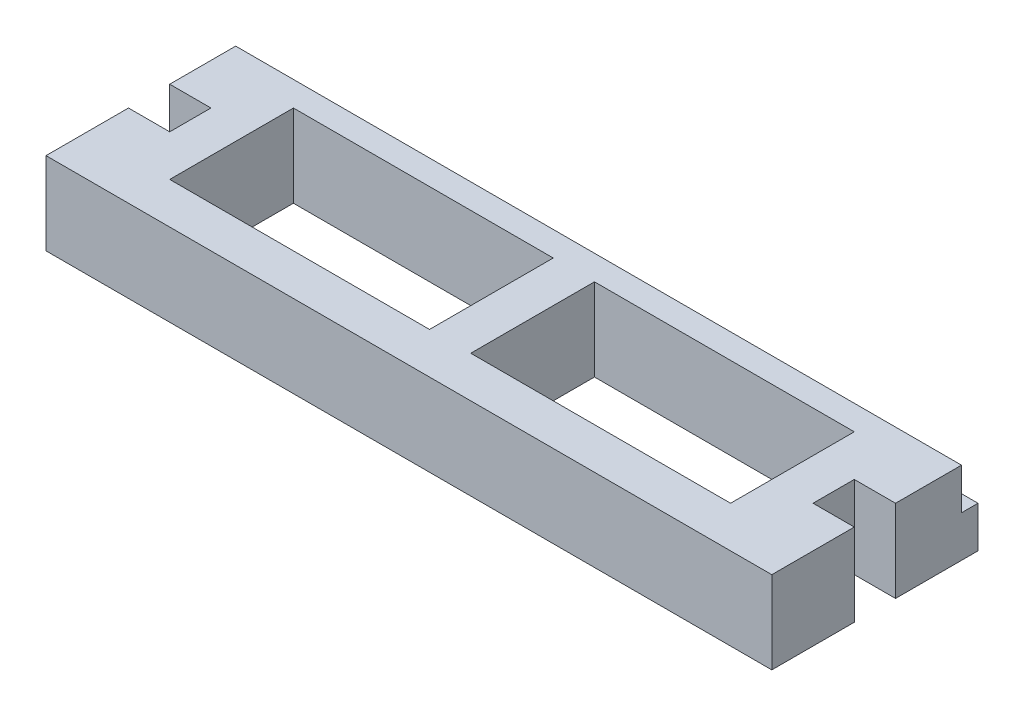
ISO-10303-21;
HEADER;
FILE_DESCRIPTION(('STEP AP214'),'2;1');
FILE_NAME('part.step','',(''),(''),'','','');
FILE_SCHEMA(('AUTOMOTIVE_DESIGN { 1 0 10303 214 1 1 1 1 }'));
ENDSEC;
DATA;
#1=APPLICATION_CONTEXT('core data for automotive mechanical design processes');
#2=APPLICATION_PROTOCOL_DEFINITION('international standard','automotive_design',2000,#1);
#3=PRODUCT_CONTEXT('',#1,'mechanical');
#4=PRODUCT('Part','Part','',(#3));
#5=PRODUCT_RELATED_PRODUCT_CATEGORY('part','',(#4));
#6=PRODUCT_DEFINITION_FORMATION('','',#4);
#7=PRODUCT_DEFINITION_CONTEXT('part definition',#1,'design');
#8=PRODUCT_DEFINITION('design','',#6,#7);
#9=PRODUCT_DEFINITION_SHAPE('','',#8);
#10=(LENGTH_UNIT() NAMED_UNIT(*) SI_UNIT(.MILLI.,.METRE.));
#11=(NAMED_UNIT(*) PLANE_ANGLE_UNIT() SI_UNIT($,.RADIAN.));
#12=(NAMED_UNIT(*) SI_UNIT($,.STERADIAN.) SOLID_ANGLE_UNIT());
#13=UNCERTAINTY_MEASURE_WITH_UNIT(LENGTH_MEASURE(1.E-05),#10,'distance_accuracy_value','');
#14=(GEOMETRIC_REPRESENTATION_CONTEXT(3) GLOBAL_UNCERTAINTY_ASSIGNED_CONTEXT((#13)) GLOBAL_UNIT_ASSIGNED_CONTEXT((#10,
#11,#12)) REPRESENTATION_CONTEXT('',''));
#15=CARTESIAN_POINT('',(0.,0.,0.));
#16=DIRECTION('',(0.,0.,1.));
#17=DIRECTION('',(1.,0.,0.));
#18=AXIS2_PLACEMENT_3D('',#15,#16,#17);
#19=CARTESIAN_POINT('',(0.,10.,0.));
#20=DIRECTION('',(0.,1.,0.));
#21=DIRECTION('',(0.,0.,1.));
#22=AXIS2_PLACEMENT_3D('',#19,#20,#21);
#23=PLANE('',#22);
#24=DIRECTION('',(-1.,0.,0.));
#25=VECTOR('',#24,1.);
#26=CARTESIAN_POINT('',(0.,10.,7.50000000000003));
#27=LINE('',#26,#25);
#28=CARTESIAN_POINT('',(34.,10.,7.50000000000003));
#29=VERTEX_POINT('',#28);
#30=CARTESIAN_POINT('',(2.5,10.,7.50000000000003));
#31=VERTEX_POINT('',#30);
#32=EDGE_CURVE('E342',#29,#31,#27,.T.);
#33=ORIENTED_EDGE('',*,*,#32,.T.);
#34=DIRECTION('',(0.,0.,-1.));
#35=VECTOR('',#34,1.);
#36=CARTESIAN_POINT('',(2.5,10.,0.));
#37=LINE('',#36,#35);
#38=CARTESIAN_POINT('',(2.5,10.,-7.5));
#39=VERTEX_POINT('',#38);
#40=EDGE_CURVE('E293',#31,#39,#37,.T.);
#41=ORIENTED_EDGE('',*,*,#40,.T.);
#42=DIRECTION('',(-1.,0.,0.));
#43=VECTOR('',#42,1.);
#44=CARTESIAN_POINT('',(0.,10.,-7.5));
#45=LINE('',#44,#43);
#46=CARTESIAN_POINT('',(34.,10.,-7.50000000000001));
#47=VERTEX_POINT('',#46);
#48=EDGE_CURVE('E331',#47,#39,#45,.T.);
#49=ORIENTED_EDGE('',*,*,#48,.F.);
#50=DIRECTION('',(0.,0.,1.));
#51=VECTOR('',#50,1.);
#52=CARTESIAN_POINT('',(34.,10.,0.));
#53=LINE('',#52,#51);
#54=EDGE_CURVE('E345',#47,#29,#53,.T.);
#55=ORIENTED_EDGE('',*,*,#54,.T.);
#56=EDGE_LOOP('',(#33,#41,#49,#55));
#57=FACE_BOUND('',#56,.T.);
#58=DIRECTION('',(-1.,0.,0.));
#59=VECTOR('',#58,1.);
#60=CARTESIAN_POINT('',(0.,10.,-7.5));
#61=LINE('',#60,#59);
#62=CARTESIAN_POINT('',(-2.5,10.,-7.5));
#63=VERTEX_POINT('',#62);
#64=CARTESIAN_POINT('',(-34.,10.,-7.5));
#65=VERTEX_POINT('',#64);
#66=EDGE_CURVE('E309',#63,#65,#61,.T.);
#67=ORIENTED_EDGE('',*,*,#66,.F.);
#68=DIRECTION('',(0.,0.,1.));
#69=VECTOR('',#68,1.);
#70=CARTESIAN_POINT('',(-2.5,10.,0.));
#71=LINE('',#70,#69);
#72=CARTESIAN_POINT('',(-2.5,10.,7.50000000000004));
#73=VERTEX_POINT('',#72);
#74=EDGE_CURVE('E306',#63,#73,#71,.T.);
#75=ORIENTED_EDGE('',*,*,#74,.T.);
#76=DIRECTION('',(-1.,0.,0.));
#77=VECTOR('',#76,1.);
#78=CARTESIAN_POINT('',(0.,10.,7.50000000000004));
#79=LINE('',#78,#77);
#80=CARTESIAN_POINT('',(-34.,10.,7.50000000000002));
#81=VERTEX_POINT('',#80);
#82=EDGE_CURVE('E297',#73,#81,#79,.T.);
#83=ORIENTED_EDGE('',*,*,#82,.T.);
#84=DIRECTION('',(0.,0.,-1.));
#85=VECTOR('',#84,1.);
#86=CARTESIAN_POINT('',(-34.,10.,0.));
#87=LINE('',#86,#85);
#88=EDGE_CURVE('E313',#81,#65,#87,.T.);
#89=ORIENTED_EDGE('',*,*,#88,.T.);
#90=EDGE_LOOP('',(#67,#75,#83,#89));
#91=FACE_BOUND('',#90,.T.);
#92=DIRECTION('',(0.,0.,1.));
#93=VECTOR('',#92,1.);
#94=CARTESIAN_POINT('',(44.,10.,-12.5));
#95=LINE('',#94,#93);
#96=CARTESIAN_POINT('',(44.,10.,-10.5));
#97=VERTEX_POINT('',#96);
#98=CARTESIAN_POINT('',(44.,10.,-2.5));
#99=VERTEX_POINT('',#98);
#100=EDGE_CURVE('E273',#97,#99,#95,.T.);
#101=ORIENTED_EDGE('',*,*,#100,.F.);
#102=DIRECTION('',(1.,0.,0.));
#103=VECTOR('',#102,1.);
#104=CARTESIAN_POINT('',(44.,10.,-10.5));
#105=LINE('',#104,#103);
#106=CARTESIAN_POINT('',(-44.,10.,-10.5));
#107=VERTEX_POINT('',#106);
#108=EDGE_CURVE('E60',#107,#97,#105,.T.);
#109=ORIENTED_EDGE('',*,*,#108,.F.);
#110=DIRECTION('',(0.,0.,-1.));
#111=VECTOR('',#110,1.);
#112=CARTESIAN_POINT('',(-44.,10.,-12.5));
#113=LINE('',#112,#111);
#114=CARTESIAN_POINT('',(-44.,10.,-2.5));
#115=VERTEX_POINT('',#114);
#116=EDGE_CURVE('E289',#115,#107,#113,.T.);
#117=ORIENTED_EDGE('',*,*,#116,.F.);
#118=DIRECTION('',(-1.,0.,0.));
#119=VECTOR('',#118,1.);
#120=CARTESIAN_POINT('',(-39.,10.,-2.5));
#121=LINE('',#120,#119);
#122=CARTESIAN_POINT('',(-39.,10.,-2.5));
#123=VERTEX_POINT('',#122);
#124=EDGE_CURVE('E236',#123,#115,#121,.T.);
#125=ORIENTED_EDGE('',*,*,#124,.F.);
#126=DIRECTION('',(0.,0.,-1.));
#127=VECTOR('',#126,1.);
#128=CARTESIAN_POINT('',(-39.,10.,-2.5));
#129=LINE('',#128,#127);
#130=CARTESIAN_POINT('',(-39.,10.,2.5));
#131=VERTEX_POINT('',#130);
#132=EDGE_CURVE('E230',#131,#123,#129,.T.);
#133=ORIENTED_EDGE('',*,*,#132,.F.);
#134=DIRECTION('',(-1.,0.,0.));
#135=VECTOR('',#134,1.);
#136=CARTESIAN_POINT('',(-39.,10.,2.5));
#137=LINE('',#136,#135);
#138=CARTESIAN_POINT('',(-44.,10.,2.5));
#139=VERTEX_POINT('',#138);
#140=EDGE_CURVE('E239',#131,#139,#137,.T.);
#141=ORIENTED_EDGE('',*,*,#140,.T.);
#142=CARTESIAN_POINT('',(-44.,10.,12.5));
#143=VERTEX_POINT('',#142);
#144=EDGE_CURVE('E290',#143,#139,#113,.T.);
#145=ORIENTED_EDGE('',*,*,#144,.F.);
#146=DIRECTION('',(1.,0.,0.));
#147=VECTOR('',#146,1.);
#148=CARTESIAN_POINT('',(-49.,10.,12.5));
#149=LINE('',#148,#147);
#150=CARTESIAN_POINT('',(44.,10.,12.5));
#151=VERTEX_POINT('',#150);
#152=EDGE_CURVE('E11',#143,#151,#149,.T.);
#153=ORIENTED_EDGE('',*,*,#152,.T.);
#154=CARTESIAN_POINT('',(44.,10.,2.5));
#155=VERTEX_POINT('',#154);
#156=EDGE_CURVE('E272',#155,#151,#95,.T.);
#157=ORIENTED_EDGE('',*,*,#156,.F.);
#158=DIRECTION('',(1.,0.,0.));
#159=VECTOR('',#158,1.);
#160=CARTESIAN_POINT('',(39.,10.,2.5));
#161=LINE('',#160,#159);
#162=CARTESIAN_POINT('',(39.,10.,2.5));
#163=VERTEX_POINT('',#162);
#164=EDGE_CURVE('E262',#163,#155,#161,.T.);
#165=ORIENTED_EDGE('',*,*,#164,.F.);
#166=DIRECTION('',(0.,0.,1.));
#167=VECTOR('',#166,1.);
#168=CARTESIAN_POINT('',(39.,10.,2.5));
#169=LINE('',#168,#167);
#170=CARTESIAN_POINT('',(39.,10.,-2.5));
#171=VERTEX_POINT('',#170);
#172=EDGE_CURVE('E255',#171,#163,#169,.T.);
#173=ORIENTED_EDGE('',*,*,#172,.F.);
#174=DIRECTION('',(1.,0.,0.));
#175=VECTOR('',#174,1.);
#176=CARTESIAN_POINT('',(39.,10.,-2.5));
#177=LINE('',#176,#175);
#178=EDGE_CURVE('E264',#171,#99,#177,.T.);
#179=ORIENTED_EDGE('',*,*,#178,.T.);
#180=EDGE_LOOP('',(#101,#109,#117,#125,#133,#141,#145,#153,#157,#165,#173,#179));
#181=FACE_BOUND('',#180,.T.);
#182=ADVANCED_FACE('F44',(#57,#91,#181),#23,.T.);
#183=CARTESIAN_POINT('',(-44.,0.,0.));
#184=DIRECTION('',(1.,0.,0.));
#185=DIRECTION('',(0.,0.,-1.));
#186=AXIS2_PLACEMENT_3D('',#183,#184,#185);
#187=PLANE('',#186);
#188=DIRECTION('',(0.,1.,0.));
#189=VECTOR('',#188,1.);
#190=CARTESIAN_POINT('',(-44.,10.,-10.5));
#191=LINE('',#190,#189);
#192=CARTESIAN_POINT('',(-44.,5.,-10.5));
#193=VERTEX_POINT('',#192);
#194=EDGE_CURVE('E202',#193,#107,#191,.T.);
#195=ORIENTED_EDGE('',*,*,#194,.F.);
#196=DIRECTION('',(0.,0.,-1.));
#197=VECTOR('',#196,1.);
#198=CARTESIAN_POINT('',(-44.,5.,-10.5));
#199=LINE('',#198,#197);
#200=CARTESIAN_POINT('',(-44.,5.,-12.5));
#201=VERTEX_POINT('',#200);
#202=EDGE_CURVE('E200',#193,#201,#199,.T.);
#203=ORIENTED_EDGE('',*,*,#202,.T.);
#204=DIRECTION('',(0.,-1.,0.));
#205=VECTOR('',#204,1.);
#206=CARTESIAN_POINT('',(-44.,0.,-12.5));
#207=LINE('',#206,#205);
#208=CARTESIAN_POINT('',(-44.,0.,-12.5));
#209=VERTEX_POINT('',#208);
#210=EDGE_CURVE('E281',#201,#209,#207,.T.);
#211=ORIENTED_EDGE('',*,*,#210,.T.);
#212=DIRECTION('',(0.,0.,1.));
#213=VECTOR('',#212,1.);
#214=CARTESIAN_POINT('',(-44.,0.,-12.5));
#215=LINE('',#214,#213);
#216=CARTESIAN_POINT('',(-44.,0.,-2.5));
#217=VERTEX_POINT('',#216);
#218=EDGE_CURVE('E284',#209,#217,#215,.T.);
#219=ORIENTED_EDGE('',*,*,#218,.T.);
#220=DIRECTION('',(0.,-1.,0.));
#221=VECTOR('',#220,1.);
#222=CARTESIAN_POINT('',(-44.,0.,-2.5));
#223=LINE('',#222,#221);
#224=EDGE_CURVE('E215',#115,#217,#223,.T.);
#225=ORIENTED_EDGE('',*,*,#224,.F.);
#226=ORIENTED_EDGE('',*,*,#116,.T.);
#227=EDGE_LOOP('',(#195,#203,#211,#219,#225,#226));
#228=FACE_BOUND('',#227,.T.);
#229=ADVANCED_FACE('F396',(#228),#187,.F.);
#230=CARTESIAN_POINT('',(44.,0.,0.));
#231=DIRECTION('',(-1.,0.,0.));
#232=DIRECTION('',(0.,0.,1.));
#233=AXIS2_PLACEMENT_3D('',#230,#231,#232);
#234=PLANE('',#233);
#235=DIRECTION('',(0.,0.,-1.));
#236=VECTOR('',#235,1.);
#237=CARTESIAN_POINT('',(44.,0.,-12.5));
#238=LINE('',#237,#236);
#239=CARTESIAN_POINT('',(44.,0.,12.5));
#240=VERTEX_POINT('',#239);
#241=CARTESIAN_POINT('',(44.,0.,2.5));
#242=VERTEX_POINT('',#241);
#243=EDGE_CURVE('E278',#240,#242,#238,.T.);
#244=ORIENTED_EDGE('',*,*,#243,.T.);
#245=DIRECTION('',(0.,-1.,0.));
#246=VECTOR('',#245,1.);
#247=CARTESIAN_POINT('',(44.,10.,2.5));
#248=LINE('',#247,#246);
#249=EDGE_CURVE('E238',#155,#242,#248,.T.);
#250=ORIENTED_EDGE('',*,*,#249,.F.);
#251=ORIENTED_EDGE('',*,*,#156,.T.);
#252=DIRECTION('',(0.,-1.,0.));
#253=VECTOR('',#252,1.);
#254=CARTESIAN_POINT('',(44.,10.,12.5));
#255=LINE('',#254,#253);
#256=EDGE_CURVE('E275',#151,#240,#255,.T.);
#257=ORIENTED_EDGE('',*,*,#256,.T.);
#258=EDGE_LOOP('',(#244,#250,#251,#257));
#259=FACE_BOUND('',#258,.T.);
#260=ADVANCED_FACE('F377',(#259),#234,.F.);
#261=CARTESIAN_POINT('',(0.,0.,0.));
#262=DIRECTION('',(0.,1.,0.));
#263=DIRECTION('',(0.,0.,1.));
#264=AXIS2_PLACEMENT_3D('',#261,#262,#263);
#265=PLANE('',#264);
#266=DIRECTION('',(0.,0.,-1.));
#267=VECTOR('',#266,1.);
#268=CARTESIAN_POINT('',(2.5,0.,0.));
#269=LINE('',#268,#267);
#270=CARTESIAN_POINT('',(2.5,0.,7.50000000000003));
#271=VERTEX_POINT('',#270);
#272=CARTESIAN_POINT('',(2.5,0.,-7.5));
#273=VERTEX_POINT('',#272);
#274=EDGE_CURVE('E328',#271,#273,#269,.T.);
#275=ORIENTED_EDGE('',*,*,#274,.F.);
#276=DIRECTION('',(-1.,0.,0.));
#277=VECTOR('',#276,1.);
#278=CARTESIAN_POINT('',(0.,0.,7.50000000000003));
#279=LINE('',#278,#277);
#280=CARTESIAN_POINT('',(34.,0.,7.50000000000003));
#281=VERTEX_POINT('',#280);
#282=EDGE_CURVE('E330',#281,#271,#279,.T.);
#283=ORIENTED_EDGE('',*,*,#282,.F.);
#284=DIRECTION('',(0.,0.,1.));
#285=VECTOR('',#284,1.);
#286=CARTESIAN_POINT('',(34.,0.,0.));
#287=LINE('',#286,#285);
#288=CARTESIAN_POINT('',(34.,0.,-7.50000000000001));
#289=VERTEX_POINT('',#288);
#290=EDGE_CURVE('E333',#289,#281,#287,.T.);
#291=ORIENTED_EDGE('',*,*,#290,.F.);
#292=DIRECTION('',(-1.,0.,0.));
#293=VECTOR('',#292,1.);
#294=CARTESIAN_POINT('',(0.,0.,-7.5));
#295=LINE('',#294,#293);
#296=EDGE_CURVE('E336',#289,#273,#295,.T.);
#297=ORIENTED_EDGE('',*,*,#296,.T.);
#298=EDGE_LOOP('',(#275,#283,#291,#297));
#299=FACE_BOUND('',#298,.T.);
#300=DIRECTION('',(0.,0.,1.));
#301=VECTOR('',#300,1.);
#302=CARTESIAN_POINT('',(-39.,0.,-2.5));
#303=LINE('',#302,#301);
#304=CARTESIAN_POINT('',(-39.,0.,-2.5));
#305=VERTEX_POINT('',#304);
#306=CARTESIAN_POINT('',(-39.,0.,2.5));
#307=VERTEX_POINT('',#306);
#308=EDGE_CURVE('E223',#305,#307,#303,.T.);
#309=ORIENTED_EDGE('',*,*,#308,.F.);
#310=DIRECTION('',(-1.,0.,0.));
#311=VECTOR('',#310,1.);
#312=CARTESIAN_POINT('',(-39.,0.,-2.5));
#313=LINE('',#312,#311);
#314=EDGE_CURVE('E233',#305,#217,#313,.T.);
#315=ORIENTED_EDGE('',*,*,#314,.T.);
#316=ORIENTED_EDGE('',*,*,#218,.F.);
#317=DIRECTION('',(-1.,0.,0.));
#318=VECTOR('',#317,1.);
#319=CARTESIAN_POINT('',(-49.,0.,-12.5));
#320=LINE('',#319,#318);
#321=CARTESIAN_POINT('',(44.,0.,-12.5));
#322=VERTEX_POINT('',#321);
#323=EDGE_CURVE('E321',#322,#209,#320,.T.);
#324=ORIENTED_EDGE('',*,*,#323,.F.);
#325=CARTESIAN_POINT('',(44.,0.,-2.5));
#326=VERTEX_POINT('',#325);
#327=EDGE_CURVE('E277',#326,#322,#238,.T.);
#328=ORIENTED_EDGE('',*,*,#327,.F.);
#329=DIRECTION('',(1.,0.,0.));
#330=VECTOR('',#329,1.);
#331=CARTESIAN_POINT('',(39.,0.,-2.5));
#332=LINE('',#331,#330);
#333=CARTESIAN_POINT('',(39.,0.,-2.5));
#334=VERTEX_POINT('',#333);
#335=EDGE_CURVE('E267',#334,#326,#332,.T.);
#336=ORIENTED_EDGE('',*,*,#335,.F.);
#337=DIRECTION('',(0.,0.,-1.));
#338=VECTOR('',#337,1.);
#339=CARTESIAN_POINT('',(39.,0.,-2.5));
#340=LINE('',#339,#338);
#341=CARTESIAN_POINT('',(39.,0.,2.5));
#342=VERTEX_POINT('',#341);
#343=EDGE_CURVE('E248',#342,#334,#340,.T.);
#344=ORIENTED_EDGE('',*,*,#343,.F.);
#345=DIRECTION('',(1.,0.,0.));
#346=VECTOR('',#345,1.);
#347=CARTESIAN_POINT('',(39.,0.,2.5));
#348=LINE('',#347,#346);
#349=EDGE_CURVE('E258',#342,#242,#348,.T.);
#350=ORIENTED_EDGE('',*,*,#349,.T.);
#351=ORIENTED_EDGE('',*,*,#243,.F.);
#352=DIRECTION('',(1.,0.,0.));
#353=VECTOR('',#352,1.);
#354=CARTESIAN_POINT('',(-49.,0.,12.5));
#355=LINE('',#354,#353);
#356=CARTESIAN_POINT('',(-44.,0.,12.5));
#357=VERTEX_POINT('',#356);
#358=EDGE_CURVE('E48',#357,#240,#355,.T.);
#359=ORIENTED_EDGE('',*,*,#358,.F.);
#360=CARTESIAN_POINT('',(-44.,0.,2.5));
#361=VERTEX_POINT('',#360);
#362=EDGE_CURVE('E283',#361,#357,#215,.T.);
#363=ORIENTED_EDGE('',*,*,#362,.F.);
#364=DIRECTION('',(-1.,0.,0.));
#365=VECTOR('',#364,1.);
#366=CARTESIAN_POINT('',(-39.,0.,2.5));
#367=LINE('',#366,#365);
#368=EDGE_CURVE('E68',#307,#361,#367,.T.);
#369=ORIENTED_EDGE('',*,*,#368,.F.);
#370=EDGE_LOOP('',(#309,#315,#316,#324,#328,#336,#344,#350,#351,#359,#363,#369));
#371=FACE_BOUND('',#370,.T.);
#372=DIRECTION('',(0.,0.,1.));
#373=VECTOR('',#372,1.);
#374=CARTESIAN_POINT('',(-2.5,0.,0.));
#375=LINE('',#374,#373);
#376=CARTESIAN_POINT('',(-2.5,0.,-7.5));
#377=VERTEX_POINT('',#376);
#378=CARTESIAN_POINT('',(-2.5,0.,7.50000000000004));
#379=VERTEX_POINT('',#378);
#380=EDGE_CURVE('E294',#377,#379,#375,.T.);
#381=ORIENTED_EDGE('',*,*,#380,.F.);
#382=DIRECTION('',(-1.,0.,0.));
#383=VECTOR('',#382,1.);
#384=CARTESIAN_POINT('',(0.,0.,-7.5));
#385=LINE('',#384,#383);
#386=CARTESIAN_POINT('',(-34.,0.,-7.5));
#387=VERTEX_POINT('',#386);
#388=EDGE_CURVE('E296',#377,#387,#385,.T.);
#389=ORIENTED_EDGE('',*,*,#388,.T.);
#390=DIRECTION('',(0.,0.,-1.));
#391=VECTOR('',#390,1.);
#392=CARTESIAN_POINT('',(-34.,0.,0.));
#393=LINE('',#392,#391);
#394=CARTESIAN_POINT('',(-34.,0.,7.50000000000002));
#395=VERTEX_POINT('',#394);
#396=EDGE_CURVE('E300',#395,#387,#393,.T.);
#397=ORIENTED_EDGE('',*,*,#396,.F.);
#398=DIRECTION('',(-1.,0.,0.));
#399=VECTOR('',#398,1.);
#400=CARTESIAN_POINT('',(0.,0.,7.50000000000004));
#401=LINE('',#400,#399);
#402=EDGE_CURVE('E303',#379,#395,#401,.T.);
#403=ORIENTED_EDGE('',*,*,#402,.F.);
#404=EDGE_LOOP('',(#381,#389,#397,#403));
#405=FACE_BOUND('',#404,.T.);
#406=ADVANCED_FACE('F372',(#299,#371,#405),#265,.F.);
#407=CARTESIAN_POINT('',(-49.,10.,-12.5));
#408=DIRECTION('',(0.,0.,1.));
#409=DIRECTION('',(1.,0.,0.));
#410=AXIS2_PLACEMENT_3D('',#407,#408,#409);
#411=PLANE('',#410);
#412=ORIENTED_EDGE('',*,*,#210,.F.);
#413=DIRECTION('',(-1.,0.,0.));
#414=VECTOR('',#413,1.);
#415=CARTESIAN_POINT('',(44.,5.,-12.5));
#416=LINE('',#415,#414);
#417=CARTESIAN_POINT('',(44.,5.,-12.5));
#418=VERTEX_POINT('',#417);
#419=EDGE_CURVE('E208',#418,#201,#416,.T.);
#420=ORIENTED_EDGE('',*,*,#419,.F.);
#421=DIRECTION('',(0.,1.,0.));
#422=VECTOR('',#421,1.);
#423=CARTESIAN_POINT('',(44.,10.,-12.5));
#424=LINE('',#423,#422);
#425=EDGE_CURVE('E213',#322,#418,#424,.T.);
#426=ORIENTED_EDGE('',*,*,#425,.F.);
#427=ORIENTED_EDGE('',*,*,#323,.T.);
#428=EDGE_LOOP('',(#412,#420,#426,#427));
#429=FACE_BOUND('',#428,.T.);
#430=ADVANCED_FACE('F46',(#429),#411,.F.);
#431=CARTESIAN_POINT('',(-49.,10.,12.5));
#432=DIRECTION('',(0.,0.,-1.));
#433=DIRECTION('',(-1.,0.,0.));
#434=AXIS2_PLACEMENT_3D('',#431,#432,#433);
#435=PLANE('',#434);
#436=ORIENTED_EDGE('',*,*,#358,.T.);
#437=ORIENTED_EDGE('',*,*,#256,.F.);
#438=ORIENTED_EDGE('',*,*,#152,.F.);
#439=DIRECTION('',(0.,1.,0.));
#440=VECTOR('',#439,1.);
#441=CARTESIAN_POINT('',(-44.,0.,12.5));
#442=LINE('',#441,#440);
#443=EDGE_CURVE('E287',#357,#143,#442,.T.);
#444=ORIENTED_EDGE('',*,*,#443,.F.);
#445=EDGE_LOOP('',(#436,#437,#438,#444));
#446=FACE_BOUND('',#445,.T.);
#447=ADVANCED_FACE('F366',(#446),#435,.F.);
#448=CARTESIAN_POINT('',(2.5,0.,0.));
#449=DIRECTION('',(1.,0.,0.));
#450=DIRECTION('',(0.,0.,-1.));
#451=AXIS2_PLACEMENT_3D('',#448,#449,#450);
#452=PLANE('',#451);
#453=ORIENTED_EDGE('',*,*,#40,.F.);
#454=DIRECTION('',(0.,1.,0.));
#455=VECTOR('',#454,1.);
#456=CARTESIAN_POINT('',(2.5,0.,7.50000000000003));
#457=LINE('',#456,#455);
#458=EDGE_CURVE('E339',#271,#31,#457,.T.);
#459=ORIENTED_EDGE('',*,*,#458,.F.);
#460=ORIENTED_EDGE('',*,*,#274,.T.);
#461=DIRECTION('',(0.,1.,0.));
#462=VECTOR('',#461,1.);
#463=CARTESIAN_POINT('',(2.5,0.,-7.5));
#464=LINE('',#463,#462);
#465=EDGE_CURVE('E310',#273,#39,#464,.T.);
#466=ORIENTED_EDGE('',*,*,#465,.T.);
#467=EDGE_LOOP('',(#453,#459,#460,#466));
#468=FACE_BOUND('',#467,.T.);
#469=ADVANCED_FACE('F425',(#468),#452,.T.);
#470=CARTESIAN_POINT('',(0.,0.,-7.5));
#471=DIRECTION('',(0.,0.,-1.));
#472=DIRECTION('',(-1.,0.,0.));
#473=AXIS2_PLACEMENT_3D('',#470,#471,#472);
#474=PLANE('',#473);
#475=ORIENTED_EDGE('',*,*,#48,.T.);
#476=ORIENTED_EDGE('',*,*,#465,.F.);
#477=ORIENTED_EDGE('',*,*,#296,.F.);
#478=DIRECTION('',(0.,1.,0.));
#479=VECTOR('',#478,1.);
#480=CARTESIAN_POINT('',(34.,0.,-7.50000000000001));
#481=LINE('',#480,#479);
#482=EDGE_CURVE('E351',#289,#47,#481,.T.);
#483=ORIENTED_EDGE('',*,*,#482,.T.);
#484=EDGE_LOOP('',(#475,#476,#477,#483));
#485=FACE_BOUND('',#484,.T.);
#486=ADVANCED_FACE('F434',(#485),#474,.F.);
#487=CARTESIAN_POINT('',(34.,0.,0.));
#488=DIRECTION('',(-1.,0.,0.));
#489=DIRECTION('',(0.,0.,1.));
#490=AXIS2_PLACEMENT_3D('',#487,#488,#489);
#491=PLANE('',#490);
#492=ORIENTED_EDGE('',*,*,#54,.F.);
#493=ORIENTED_EDGE('',*,*,#482,.F.);
#494=ORIENTED_EDGE('',*,*,#290,.T.);
#495=DIRECTION('',(0.,1.,0.));
#496=VECTOR('',#495,1.);
#497=CARTESIAN_POINT('',(34.,0.,7.50000000000003));
#498=LINE('',#497,#496);
#499=EDGE_CURVE('E353',#281,#29,#498,.T.);
#500=ORIENTED_EDGE('',*,*,#499,.T.);
#501=EDGE_LOOP('',(#492,#493,#494,#500));
#502=FACE_BOUND('',#501,.T.);
#503=ADVANCED_FACE('F570',(#502),#491,.T.);
#504=CARTESIAN_POINT('',(0.,0.,7.50000000000003));
#505=DIRECTION('',(0.,0.,-1.));
#506=DIRECTION('',(-1.,0.,0.));
#507=AXIS2_PLACEMENT_3D('',#504,#505,#506);
#508=PLANE('',#507);
#509=ORIENTED_EDGE('',*,*,#32,.F.);
#510=ORIENTED_EDGE('',*,*,#499,.F.);
#511=ORIENTED_EDGE('',*,*,#282,.T.);
#512=ORIENTED_EDGE('',*,*,#458,.T.);
#513=EDGE_LOOP('',(#509,#510,#511,#512));
#514=FACE_BOUND('',#513,.T.);
#515=ADVANCED_FACE('F562',(#514),#508,.T.);
#516=CARTESIAN_POINT('',(-2.5,0.,0.));
#517=DIRECTION('',(-1.,0.,0.));
#518=DIRECTION('',(0.,0.,1.));
#519=AXIS2_PLACEMENT_3D('',#516,#517,#518);
#520=PLANE('',#519);
#521=ORIENTED_EDGE('',*,*,#74,.F.);
#522=DIRECTION('',(0.,1.,0.));
#523=VECTOR('',#522,1.);
#524=CARTESIAN_POINT('',(-2.5,0.,-7.5));
#525=LINE('',#524,#523);
#526=EDGE_CURVE('E305',#377,#63,#525,.T.);
#527=ORIENTED_EDGE('',*,*,#526,.F.);
#528=ORIENTED_EDGE('',*,*,#380,.T.);
#529=DIRECTION('',(0.,1.,0.));
#530=VECTOR('',#529,1.);
#531=CARTESIAN_POINT('',(-2.5,0.,7.50000000000004));
#532=LINE('',#531,#530);
#533=EDGE_CURVE('E318',#379,#73,#532,.T.);
#534=ORIENTED_EDGE('',*,*,#533,.T.);
#535=EDGE_LOOP('',(#521,#527,#528,#534));
#536=FACE_BOUND('',#535,.T.);
#537=ADVANCED_FACE('F554',(#536),#520,.T.);
#538=CARTESIAN_POINT('',(0.,0.,7.50000000000004));
#539=DIRECTION('',(0.,0.,-1.));
#540=DIRECTION('',(-1.,0.,0.));
#541=AXIS2_PLACEMENT_3D('',#538,#539,#540);
#542=PLANE('',#541);
#543=ORIENTED_EDGE('',*,*,#82,.F.);
#544=ORIENTED_EDGE('',*,*,#533,.F.);
#545=ORIENTED_EDGE('',*,*,#402,.T.);
#546=DIRECTION('',(0.,1.,0.));
#547=VECTOR('',#546,1.);
#548=CARTESIAN_POINT('',(-34.,0.,7.50000000000002));
#549=LINE('',#548,#547);
#550=EDGE_CURVE('E322',#395,#81,#549,.T.);
#551=ORIENTED_EDGE('',*,*,#550,.T.);
#552=EDGE_LOOP('',(#543,#544,#545,#551));
#553=FACE_BOUND('',#552,.T.);
#554=ADVANCED_FACE('F546',(#553),#542,.T.);
#555=CARTESIAN_POINT('',(-34.,0.,0.));
#556=DIRECTION('',(1.,0.,0.));
#557=DIRECTION('',(0.,0.,-1.));
#558=AXIS2_PLACEMENT_3D('',#555,#556,#557);
#559=PLANE('',#558);
#560=ORIENTED_EDGE('',*,*,#88,.F.);
#561=ORIENTED_EDGE('',*,*,#550,.F.);
#562=ORIENTED_EDGE('',*,*,#396,.T.);
#563=DIRECTION('',(0.,1.,0.));
#564=VECTOR('',#563,1.);
#565=CARTESIAN_POINT('',(-34.,0.,-7.5));
#566=LINE('',#565,#564);
#567=EDGE_CURVE('E324',#387,#65,#566,.T.);
#568=ORIENTED_EDGE('',*,*,#567,.T.);
#569=EDGE_LOOP('',(#560,#561,#562,#568));
#570=FACE_BOUND('',#569,.T.);
#571=ADVANCED_FACE('F539',(#570),#559,.T.);
#572=CARTESIAN_POINT('',(0.,0.,-7.5));
#573=DIRECTION('',(0.,0.,-1.));
#574=DIRECTION('',(-1.,0.,0.));
#575=AXIS2_PLACEMENT_3D('',#572,#573,#574);
#576=PLANE('',#575);
#577=ORIENTED_EDGE('',*,*,#66,.T.);
#578=ORIENTED_EDGE('',*,*,#567,.F.);
#579=ORIENTED_EDGE('',*,*,#388,.F.);
#580=ORIENTED_EDGE('',*,*,#526,.T.);
#581=EDGE_LOOP('',(#577,#578,#579,#580));
#582=FACE_BOUND('',#581,.T.);
#583=ADVANCED_FACE('F493',(#582),#576,.F.);
#584=ORIENTED_EDGE('',*,*,#144,.T.);
#585=DIRECTION('',(0.,1.,0.));
#586=VECTOR('',#585,1.);
#587=CARTESIAN_POINT('',(-44.,0.,2.5));
#588=LINE('',#587,#586);
#589=EDGE_CURVE('E224',#361,#139,#588,.T.);
#590=ORIENTED_EDGE('',*,*,#589,.F.);
#591=ORIENTED_EDGE('',*,*,#362,.T.);
#592=ORIENTED_EDGE('',*,*,#443,.T.);
#593=EDGE_LOOP('',(#584,#590,#591,#592));
#594=FACE_BOUND('',#593,.T.);
#595=ADVANCED_FACE('F385',(#594),#187,.F.);
#596=ORIENTED_EDGE('',*,*,#425,.T.);
#597=DIRECTION('',(0.,0.,-1.));
#598=VECTOR('',#597,1.);
#599=CARTESIAN_POINT('',(44.,5.,-10.5));
#600=LINE('',#599,#598);
#601=CARTESIAN_POINT('',(44.,5.,-10.5));
#602=VERTEX_POINT('',#601);
#603=EDGE_CURVE('E197',#602,#418,#600,.T.);
#604=ORIENTED_EDGE('',*,*,#603,.F.);
#605=DIRECTION('',(0.,-1.,0.));
#606=VECTOR('',#605,1.);
#607=CARTESIAN_POINT('',(44.,10.,-10.5));
#608=LINE('',#607,#606);
#609=EDGE_CURVE('E203',#97,#602,#608,.T.);
#610=ORIENTED_EDGE('',*,*,#609,.F.);
#611=ORIENTED_EDGE('',*,*,#100,.T.);
#612=DIRECTION('',(0.,1.,0.));
#613=VECTOR('',#612,1.);
#614=CARTESIAN_POINT('',(44.,10.,-2.5));
#615=LINE('',#614,#613);
#616=EDGE_CURVE('E249',#326,#99,#615,.T.);
#617=ORIENTED_EDGE('',*,*,#616,.F.);
#618=ORIENTED_EDGE('',*,*,#327,.T.);
#619=EDGE_LOOP('',(#596,#604,#610,#611,#617,#618));
#620=FACE_BOUND('',#619,.T.);
#621=ADVANCED_FACE('F211',(#620),#234,.F.);
#622=CARTESIAN_POINT('',(39.,10.,2.5));
#623=DIRECTION('',(0.,0.,1.));
#624=DIRECTION('',(0.,-1.,0.));
#625=AXIS2_PLACEMENT_3D('',#622,#623,#624);
#626=PLANE('',#625);
#627=ORIENTED_EDGE('',*,*,#249,.T.);
#628=ORIENTED_EDGE('',*,*,#349,.F.);
#629=DIRECTION('',(0.,-1.,0.));
#630=VECTOR('',#629,1.);
#631=CARTESIAN_POINT('',(39.,10.,2.5));
#632=LINE('',#631,#630);
#633=EDGE_CURVE('E245',#163,#342,#632,.T.);
#634=ORIENTED_EDGE('',*,*,#633,.F.);
#635=ORIENTED_EDGE('',*,*,#164,.T.);
#636=EDGE_LOOP('',(#627,#628,#634,#635));
#637=FACE_BOUND('',#636,.T.);
#638=ADVANCED_FACE('F406',(#637),#626,.F.);
#639=CARTESIAN_POINT('',(39.,10.,-2.5));
#640=DIRECTION('',(0.,0.,-1.));
#641=DIRECTION('',(0.,1.,0.));
#642=AXIS2_PLACEMENT_3D('',#639,#640,#641);
#643=PLANE('',#642);
#644=ORIENTED_EDGE('',*,*,#616,.T.);
#645=ORIENTED_EDGE('',*,*,#178,.F.);
#646=DIRECTION('',(0.,1.,0.));
#647=VECTOR('',#646,1.);
#648=CARTESIAN_POINT('',(39.,10.,-2.5));
#649=LINE('',#648,#647);
#650=EDGE_CURVE('E252',#334,#171,#649,.T.);
#651=ORIENTED_EDGE('',*,*,#650,.F.);
#652=ORIENTED_EDGE('',*,*,#335,.T.);
#653=EDGE_LOOP('',(#644,#645,#651,#652));
#654=FACE_BOUND('',#653,.T.);
#655=ADVANCED_FACE('F402',(#654),#643,.F.);
#656=CARTESIAN_POINT('',(39.,0.,0.));
#657=DIRECTION('',(-1.,0.,0.));
#658=DIRECTION('',(0.,0.,1.));
#659=AXIS2_PLACEMENT_3D('',#656,#657,#658);
#660=PLANE('',#659);
#661=ORIENTED_EDGE('',*,*,#633,.T.);
#662=ORIENTED_EDGE('',*,*,#343,.T.);
#663=ORIENTED_EDGE('',*,*,#650,.T.);
#664=ORIENTED_EDGE('',*,*,#172,.T.);
#665=EDGE_LOOP('',(#661,#662,#663,#664));
#666=FACE_BOUND('',#665,.T.);
#667=ADVANCED_FACE('F404',(#666),#660,.F.);
#668=CARTESIAN_POINT('',(-39.,0.,-2.5));
#669=DIRECTION('',(0.,0.,-1.));
#670=DIRECTION('',(-1.,0.,0.));
#671=AXIS2_PLACEMENT_3D('',#668,#669,#670);
#672=PLANE('',#671);
#673=ORIENTED_EDGE('',*,*,#224,.T.);
#674=ORIENTED_EDGE('',*,*,#314,.F.);
#675=DIRECTION('',(0.,-1.,0.));
#676=VECTOR('',#675,1.);
#677=CARTESIAN_POINT('',(-39.,0.,-2.5));
#678=LINE('',#677,#676);
#679=EDGE_CURVE('E220',#123,#305,#678,.T.);
#680=ORIENTED_EDGE('',*,*,#679,.F.);
#681=ORIENTED_EDGE('',*,*,#124,.T.);
#682=EDGE_LOOP('',(#673,#674,#680,#681));
#683=FACE_BOUND('',#682,.T.);
#684=ADVANCED_FACE('F394',(#683),#672,.F.);
#685=CARTESIAN_POINT('',(-39.,0.,2.5));
#686=DIRECTION('',(0.,0.,1.));
#687=DIRECTION('',(1.,0.,0.));
#688=AXIS2_PLACEMENT_3D('',#685,#686,#687);
#689=PLANE('',#688);
#690=ORIENTED_EDGE('',*,*,#589,.T.);
#691=ORIENTED_EDGE('',*,*,#140,.F.);
#692=DIRECTION('',(0.,1.,0.));
#693=VECTOR('',#692,1.);
#694=CARTESIAN_POINT('',(-39.,0.,2.5));
#695=LINE('',#694,#693);
#696=EDGE_CURVE('E227',#307,#131,#695,.T.);
#697=ORIENTED_EDGE('',*,*,#696,.F.);
#698=ORIENTED_EDGE('',*,*,#368,.T.);
#699=EDGE_LOOP('',(#690,#691,#697,#698));
#700=FACE_BOUND('',#699,.T.);
#701=ADVANCED_FACE('F386',(#700),#689,.F.);
#702=CARTESIAN_POINT('',(-39.,0.,0.));
#703=DIRECTION('',(1.,0.,0.));
#704=DIRECTION('',(0.,0.,-1.));
#705=AXIS2_PLACEMENT_3D('',#702,#703,#704);
#706=PLANE('',#705);
#707=ORIENTED_EDGE('',*,*,#679,.T.);
#708=ORIENTED_EDGE('',*,*,#308,.T.);
#709=ORIENTED_EDGE('',*,*,#696,.T.);
#710=ORIENTED_EDGE('',*,*,#132,.T.);
#711=EDGE_LOOP('',(#707,#708,#709,#710));
#712=FACE_BOUND('',#711,.T.);
#713=ADVANCED_FACE('F388',(#712),#706,.F.);
#714=CARTESIAN_POINT('',(44.,5.,-10.5));
#715=DIRECTION('',(0.,-1.,0.));
#716=DIRECTION('',(0.,0.,-1.));
#717=AXIS2_PLACEMENT_3D('',#714,#715,#716);
#718=PLANE('',#717);
#719=ORIENTED_EDGE('',*,*,#419,.T.);
#720=ORIENTED_EDGE('',*,*,#202,.F.);
#721=DIRECTION('',(-1.,0.,0.));
#722=VECTOR('',#721,1.);
#723=CARTESIAN_POINT('',(44.,5.,-10.5));
#724=LINE('',#723,#722);
#725=EDGE_CURVE('E194',#602,#193,#724,.T.);
#726=ORIENTED_EDGE('',*,*,#725,.F.);
#727=ORIENTED_EDGE('',*,*,#603,.T.);
#728=EDGE_LOOP('',(#719,#720,#726,#727));
#729=FACE_BOUND('',#728,.T.);
#730=ADVANCED_FACE('F195',(#729),#718,.F.);
#731=CARTESIAN_POINT('',(0.,0.,-10.5));
#732=DIRECTION('',(0.,0.,-1.));
#733=DIRECTION('',(-1.,0.,0.));
#734=AXIS2_PLACEMENT_3D('',#731,#732,#733);
#735=PLANE('',#734);
#736=ORIENTED_EDGE('',*,*,#609,.T.);
#737=ORIENTED_EDGE('',*,*,#725,.T.);
#738=ORIENTED_EDGE('',*,*,#194,.T.);
#739=ORIENTED_EDGE('',*,*,#108,.T.);
#740=EDGE_LOOP('',(#736,#737,#738,#739));
#741=FACE_BOUND('',#740,.T.);
#742=ADVANCED_FACE('F205',(#741),#735,.T.);
#743=CLOSED_SHELL('',(#182,#229,#260,#406,#430,#447,#469,#486,#503,#515,#537,#554,#571,#583,
#595,#621,#638,#655,#667,#684,#701,#713,#730,#742));
#744=MANIFOLD_SOLID_BREP('B2',#743);
#745=ADVANCED_BREP_SHAPE_REPRESENTATION('',(#18,#744),#14);
#746=SHAPE_DEFINITION_REPRESENTATION(#9,#745);
ENDSEC;
END-ISO-10303-21;
